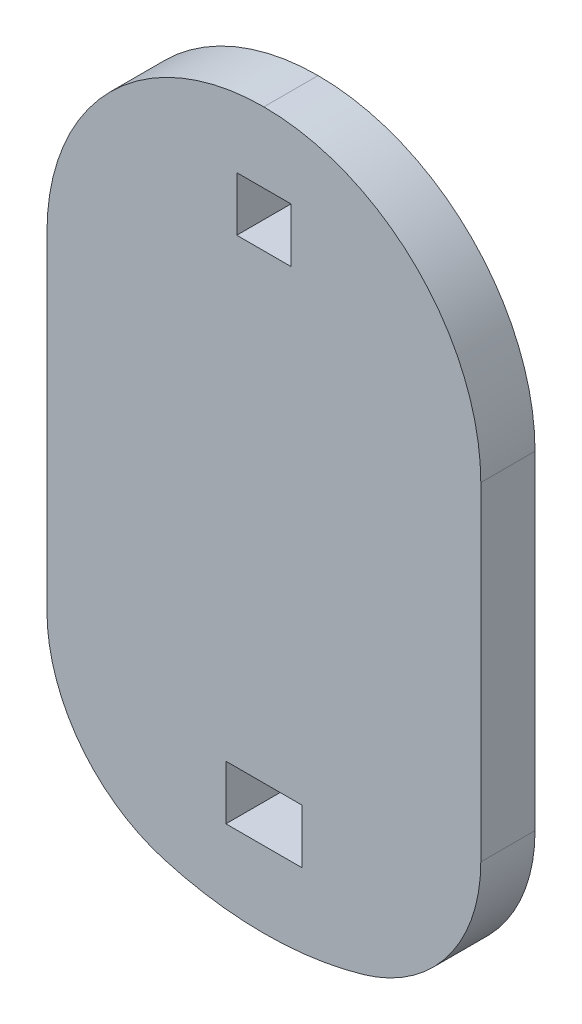
ISO-10303-21;
HEADER;
FILE_DESCRIPTION(('STEP AP214'),'2;1');
FILE_NAME('part.step','',(''),(''),'','','');
FILE_SCHEMA(('AUTOMOTIVE_DESIGN { 1 0 10303 214 1 1 1 1 }'));
ENDSEC;
DATA;
#1=APPLICATION_CONTEXT('core data for automotive mechanical design processes');
#2=APPLICATION_PROTOCOL_DEFINITION('international standard','automotive_design',2000,#1);
#3=PRODUCT_CONTEXT('',#1,'mechanical');
#4=PRODUCT('Part','Part','',(#3));
#5=PRODUCT_RELATED_PRODUCT_CATEGORY('part','',(#4));
#6=PRODUCT_DEFINITION_FORMATION('','',#4);
#7=PRODUCT_DEFINITION_CONTEXT('part definition',#1,'design');
#8=PRODUCT_DEFINITION('design','',#6,#7);
#9=PRODUCT_DEFINITION_SHAPE('','',#8);
#10=(LENGTH_UNIT() NAMED_UNIT(*) SI_UNIT(.MILLI.,.METRE.));
#11=(NAMED_UNIT(*) PLANE_ANGLE_UNIT() SI_UNIT($,.RADIAN.));
#12=(NAMED_UNIT(*) SI_UNIT($,.STERADIAN.) SOLID_ANGLE_UNIT());
#13=UNCERTAINTY_MEASURE_WITH_UNIT(LENGTH_MEASURE(1.E-05),#10,'distance_accuracy_value','');
#14=(GEOMETRIC_REPRESENTATION_CONTEXT(3) GLOBAL_UNCERTAINTY_ASSIGNED_CONTEXT((#13)) GLOBAL_UNIT_ASSIGNED_CONTEXT((#10,
#11,#12)) REPRESENTATION_CONTEXT('',''));
#15=CARTESIAN_POINT('',(0.,0.,0.));
#16=DIRECTION('',(0.,0.,1.));
#17=DIRECTION('',(1.,0.,0.));
#18=AXIS2_PLACEMENT_3D('',#15,#16,#17);
#19=CARTESIAN_POINT('',(0.,0.,5.));
#20=DIRECTION('',(0.,0.,-1.));
#21=DIRECTION('',(-1.,0.,0.));
#22=AXIS2_PLACEMENT_3D('',#19,#20,#21);
#23=CYLINDRICAL_SURFACE('',#22,33.);
#24=CARTESIAN_POINT('',(0.,0.,0.));
#25=DIRECTION('',(0.,0.,1.));
#26=DIRECTION('',(1.,0.,0.));
#27=AXIS2_PLACEMENT_3D('',#24,#25,#26);
#28=CIRCLE('',#27,33.);
#29=CARTESIAN_POINT('',(-9.16666666666666,-31.7012968539494,0.));
#30=VERTEX_POINT('',#29);
#31=CARTESIAN_POINT('',(9.16666666666667,-31.7012968539494,0.));
#32=VERTEX_POINT('',#31);
#33=EDGE_CURVE('E195',#30,#32,#28,.T.);
#34=ORIENTED_EDGE('',*,*,#33,.T.);
#35=DIRECTION('',(0.,0.,-1.));
#36=VECTOR('',#35,1.);
#37=CARTESIAN_POINT('',(9.16666666666667,-31.7012968539494,5.));
#38=LINE('',#37,#36);
#39=CARTESIAN_POINT('',(9.16666666666667,-31.7012968539494,5.));
#40=VERTEX_POINT('',#39);
#41=EDGE_CURVE('E227',#32,#40,#38,.F.);
#42=ORIENTED_EDGE('',*,*,#41,.T.);
#43=CARTESIAN_POINT('',(0.,0.,5.));
#44=DIRECTION('',(0.,0.,1.));
#45=DIRECTION('',(1.,0.,0.));
#46=AXIS2_PLACEMENT_3D('',#43,#44,#45);
#47=CIRCLE('',#46,33.);
#48=CARTESIAN_POINT('',(-9.16666666666666,-31.7012968539494,5.));
#49=VERTEX_POINT('',#48);
#50=EDGE_CURVE('E199',#49,#40,#47,.T.);
#51=ORIENTED_EDGE('',*,*,#50,.F.);
#52=DIRECTION('',(0.,0.,-1.));
#53=VECTOR('',#52,1.);
#54=CARTESIAN_POINT('',(-9.16666666666666,-31.7012968539494,5.));
#55=LINE('',#54,#53);
#56=EDGE_CURVE('E223',#49,#30,#55,.T.);
#57=ORIENTED_EDGE('',*,*,#56,.T.);
#58=EDGE_LOOP('',(#34,#42,#51,#57));
#59=FACE_BOUND('',#58,.T.);
#60=ADVANCED_FACE('F34',(#59),#23,.T.);
#61=CARTESIAN_POINT('',(0.,0.,5.));
#62=DIRECTION('',(0.,0.,1.));
#63=DIRECTION('',(1.,0.,0.));
#64=AXIS2_PLACEMENT_3D('',#61,#62,#63);
#65=PLANE('',#64);
#66=DIRECTION('',(0.,-1.,0.));
#67=VECTOR('',#66,1.);
#68=CARTESIAN_POINT('',(-2.5,26.5,5.));
#69=LINE('',#68,#67);
#70=CARTESIAN_POINT('',(-2.5,26.5,5.));
#71=VERTEX_POINT('',#70);
#72=CARTESIAN_POINT('',(-2.5,21.5,5.));
#73=VERTEX_POINT('',#72);
#74=EDGE_CURVE('E49',#71,#73,#69,.T.);
#75=ORIENTED_EDGE('',*,*,#74,.F.);
#76=DIRECTION('',(-1.,0.,0.));
#77=VECTOR('',#76,1.);
#78=CARTESIAN_POINT('',(-2.5,26.5,5.));
#79=LINE('',#78,#77);
#80=CARTESIAN_POINT('',(2.5,26.5,5.));
#81=VERTEX_POINT('',#80);
#82=EDGE_CURVE('E165',#81,#71,#79,.T.);
#83=ORIENTED_EDGE('',*,*,#82,.F.);
#84=DIRECTION('',(0.,1.,0.));
#85=VECTOR('',#84,1.);
#86=CARTESIAN_POINT('',(2.5,26.5,5.));
#87=LINE('',#86,#85);
#88=CARTESIAN_POINT('',(2.5,21.5,5.));
#89=VERTEX_POINT('',#88);
#90=EDGE_CURVE('E148',#89,#81,#87,.T.);
#91=ORIENTED_EDGE('',*,*,#90,.F.);
#92=DIRECTION('',(1.,0.,0.));
#93=VECTOR('',#92,1.);
#94=CARTESIAN_POINT('',(-2.5,21.5,5.));
#95=LINE('',#94,#93);
#96=EDGE_CURVE('E158',#73,#89,#95,.T.);
#97=ORIENTED_EDGE('',*,*,#96,.F.);
#98=EDGE_LOOP('',(#75,#83,#91,#97));
#99=FACE_BOUND('',#98,.T.);
#100=DIRECTION('',(0.,-1.,0.));
#101=VECTOR('',#100,1.);
#102=CARTESIAN_POINT('',(-3.5,-21.,5.));
#103=LINE('',#102,#101);
#104=CARTESIAN_POINT('',(-3.5,-21.,5.));
#105=VERTEX_POINT('',#104);
#106=CARTESIAN_POINT('',(-3.5,-26.,5.));
#107=VERTEX_POINT('',#106);
#108=EDGE_CURVE('E57',#105,#107,#103,.T.);
#109=ORIENTED_EDGE('',*,*,#108,.F.);
#110=DIRECTION('',(-1.,0.,0.));
#111=VECTOR('',#110,1.);
#112=CARTESIAN_POINT('',(-3.5,-21.,5.));
#113=LINE('',#112,#111);
#114=CARTESIAN_POINT('',(3.5,-21.,5.));
#115=VERTEX_POINT('',#114);
#116=EDGE_CURVE('E182',#115,#105,#113,.T.);
#117=ORIENTED_EDGE('',*,*,#116,.F.);
#118=DIRECTION('',(0.,1.,0.));
#119=VECTOR('',#118,1.);
#120=CARTESIAN_POINT('',(3.5,-21.,5.));
#121=LINE('',#120,#119);
#122=CARTESIAN_POINT('',(3.5,-26.,5.));
#123=VERTEX_POINT('',#122);
#124=EDGE_CURVE('E179',#123,#115,#121,.T.);
#125=ORIENTED_EDGE('',*,*,#124,.F.);
#126=DIRECTION('',(1.,0.,0.));
#127=VECTOR('',#126,1.);
#128=CARTESIAN_POINT('',(-3.5,-26.,5.));
#129=LINE('',#128,#127);
#130=EDGE_CURVE('E176',#107,#123,#129,.T.);
#131=ORIENTED_EDGE('',*,*,#130,.F.);
#132=EDGE_LOOP('',(#109,#117,#125,#131));
#133=FACE_BOUND('',#132,.T.);
#134=ORIENTED_EDGE('',*,*,#50,.T.);
#135=CARTESIAN_POINT('',(5.,-17.2916164657906,5.));
#136=DIRECTION('',(0.,0.,1.));
#137=DIRECTION('',(1.,0.,0.));
#138=AXIS2_PLACEMENT_3D('',#135,#136,#137);
#139=CIRCLE('',#138,15.);
#140=CARTESIAN_POINT('',(20.,-17.2916164657906,5.));
#141=VERTEX_POINT('',#140);
#142=EDGE_CURVE('E232',#40,#141,#139,.T.);
#143=ORIENTED_EDGE('',*,*,#142,.T.);
#144=DIRECTION('',(0.,-1.,0.));
#145=VECTOR('',#144,1.);
#146=CARTESIAN_POINT('',(20.,-26.2488094968134,5.));
#147=LINE('',#146,#145);
#148=CARTESIAN_POINT('',(20.,13.,5.));
#149=VERTEX_POINT('',#148);
#150=EDGE_CURVE('E196',#149,#141,#147,.T.);
#151=ORIENTED_EDGE('',*,*,#150,.F.);
#152=CARTESIAN_POINT('',(0.,13.,5.));
#153=DIRECTION('',(0.,0.,1.));
#154=DIRECTION('',(1.,0.,0.));
#155=AXIS2_PLACEMENT_3D('',#152,#153,#154);
#156=CIRCLE('',#155,20.);
#157=CARTESIAN_POINT('',(0.,33.,5.));
#158=VERTEX_POINT('',#157);
#159=EDGE_CURVE('E209',#149,#158,#156,.T.);
#160=ORIENTED_EDGE('',*,*,#159,.T.);
#161=CARTESIAN_POINT('',(0.,13.,5.));
#162=DIRECTION('',(0.,0.,1.));
#163=DIRECTION('',(1.,0.,0.));
#164=AXIS2_PLACEMENT_3D('',#161,#162,#163);
#165=CIRCLE('',#164,20.);
#166=CARTESIAN_POINT('',(-20.,13.,5.));
#167=VERTEX_POINT('',#166);
#168=EDGE_CURVE('E211',#158,#167,#165,.T.);
#169=ORIENTED_EDGE('',*,*,#168,.T.);
#170=DIRECTION('',(0.,1.,0.));
#171=VECTOR('',#170,1.);
#172=CARTESIAN_POINT('',(-20.,26.2488094968134,5.));
#173=LINE('',#172,#171);
#174=CARTESIAN_POINT('',(-20.,-17.2916164657906,5.));
#175=VERTEX_POINT('',#174);
#176=EDGE_CURVE('E193',#175,#167,#173,.T.);
#177=ORIENTED_EDGE('',*,*,#176,.F.);
#178=CARTESIAN_POINT('',(-5.,-17.2916164657906,5.));
#179=DIRECTION('',(0.,0.,1.));
#180=DIRECTION('',(1.,0.,0.));
#181=AXIS2_PLACEMENT_3D('',#178,#179,#180);
#182=CIRCLE('',#181,15.);
#183=EDGE_CURVE('E230',#175,#49,#182,.T.);
#184=ORIENTED_EDGE('',*,*,#183,.T.);
#185=EDGE_LOOP('',(#134,#143,#151,#160,#169,#177,#184));
#186=FACE_BOUND('',#185,.T.);
#187=ADVANCED_FACE('F162',(#99,#133,#186),#65,.T.);
#188=CARTESIAN_POINT('',(0.,0.,0.));
#189=DIRECTION('',(0.,0.,1.));
#190=DIRECTION('',(1.,0.,0.));
#191=AXIS2_PLACEMENT_3D('',#188,#189,#190);
#192=PLANE('',#191);
#193=DIRECTION('',(-1.,0.,0.));
#194=VECTOR('',#193,1.);
#195=CARTESIAN_POINT('',(0.,26.5,0.));
#196=LINE('',#195,#194);
#197=CARTESIAN_POINT('',(2.5,26.5,0.));
#198=VERTEX_POINT('',#197);
#199=CARTESIAN_POINT('',(-2.5,26.5,0.));
#200=VERTEX_POINT('',#199);
#201=EDGE_CURVE('E42',#198,#200,#196,.T.);
#202=ORIENTED_EDGE('',*,*,#201,.T.);
#203=DIRECTION('',(0.,-1.,0.));
#204=VECTOR('',#203,1.);
#205=CARTESIAN_POINT('',(-2.5,0.,0.));
#206=LINE('',#205,#204);
#207=CARTESIAN_POINT('',(-2.5,21.5,0.));
#208=VERTEX_POINT('',#207);
#209=EDGE_CURVE('E11',#200,#208,#206,.T.);
#210=ORIENTED_EDGE('',*,*,#209,.T.);
#211=DIRECTION('',(1.,0.,0.));
#212=VECTOR('',#211,1.);
#213=CARTESIAN_POINT('',(0.,21.5,0.));
#214=LINE('',#213,#212);
#215=CARTESIAN_POINT('',(2.5,21.5,0.));
#216=VERTEX_POINT('',#215);
#217=EDGE_CURVE('E255',#208,#216,#214,.T.);
#218=ORIENTED_EDGE('',*,*,#217,.T.);
#219=DIRECTION('',(0.,1.,0.));
#220=VECTOR('',#219,1.);
#221=CARTESIAN_POINT('',(2.5,0.,0.));
#222=LINE('',#221,#220);
#223=EDGE_CURVE('E151',#216,#198,#222,.T.);
#224=ORIENTED_EDGE('',*,*,#223,.T.);
#225=EDGE_LOOP('',(#202,#210,#218,#224));
#226=FACE_BOUND('',#225,.T.);
#227=DIRECTION('',(-1.,0.,0.));
#228=VECTOR('',#227,1.);
#229=CARTESIAN_POINT('',(0.,-21.,0.));
#230=LINE('',#229,#228);
#231=CARTESIAN_POINT('',(3.5,-21.,0.));
#232=VERTEX_POINT('',#231);
#233=CARTESIAN_POINT('',(-3.5,-21.,0.));
#234=VERTEX_POINT('',#233);
#235=EDGE_CURVE('E249',#232,#234,#230,.T.);
#236=ORIENTED_EDGE('',*,*,#235,.T.);
#237=DIRECTION('',(0.,-1.,0.));
#238=VECTOR('',#237,1.);
#239=CARTESIAN_POINT('',(-3.5,0.,0.));
#240=LINE('',#239,#238);
#241=CARTESIAN_POINT('',(-3.5,-26.,0.));
#242=VERTEX_POINT('',#241);
#243=EDGE_CURVE('E252',#234,#242,#240,.T.);
#244=ORIENTED_EDGE('',*,*,#243,.T.);
#245=DIRECTION('',(1.,0.,0.));
#246=VECTOR('',#245,1.);
#247=CARTESIAN_POINT('',(0.,-26.,0.));
#248=LINE('',#247,#246);
#249=CARTESIAN_POINT('',(3.5,-26.,0.));
#250=VERTEX_POINT('',#249);
#251=EDGE_CURVE('E243',#242,#250,#248,.T.);
#252=ORIENTED_EDGE('',*,*,#251,.T.);
#253=DIRECTION('',(0.,1.,0.));
#254=VECTOR('',#253,1.);
#255=CARTESIAN_POINT('',(3.5,0.,0.));
#256=LINE('',#255,#254);
#257=EDGE_CURVE('E246',#250,#232,#256,.T.);
#258=ORIENTED_EDGE('',*,*,#257,.T.);
#259=EDGE_LOOP('',(#236,#244,#252,#258));
#260=FACE_BOUND('',#259,.T.);
#261=DIRECTION('',(0.,-1.,0.));
#262=VECTOR('',#261,1.);
#263=CARTESIAN_POINT('',(20.,0.,0.));
#264=LINE('',#263,#262);
#265=CARTESIAN_POINT('',(20.,13.,0.));
#266=VERTEX_POINT('',#265);
#267=CARTESIAN_POINT('',(20.,-17.2916164657906,0.));
#268=VERTEX_POINT('',#267);
#269=EDGE_CURVE('E202',#266,#268,#264,.T.);
#270=ORIENTED_EDGE('',*,*,#269,.T.);
#271=CARTESIAN_POINT('',(5.,-17.2916164657906,0.));
#272=DIRECTION('',(0.,0.,1.));
#273=DIRECTION('',(1.,0.,0.));
#274=AXIS2_PLACEMENT_3D('',#271,#272,#273);
#275=CIRCLE('',#274,15.);
#276=EDGE_CURVE('E238',#268,#32,#275,.F.);
#277=ORIENTED_EDGE('',*,*,#276,.T.);
#278=ORIENTED_EDGE('',*,*,#33,.F.);
#279=CARTESIAN_POINT('',(-5.,-17.2916164657906,0.));
#280=DIRECTION('',(0.,0.,1.));
#281=DIRECTION('',(1.,0.,0.));
#282=AXIS2_PLACEMENT_3D('',#279,#280,#281);
#283=CIRCLE('',#282,15.);
#284=CARTESIAN_POINT('',(-20.,-17.2916164657906,0.));
#285=VERTEX_POINT('',#284);
#286=EDGE_CURVE('E236',#30,#285,#283,.F.);
#287=ORIENTED_EDGE('',*,*,#286,.T.);
#288=DIRECTION('',(0.,1.,0.));
#289=VECTOR('',#288,1.);
#290=CARTESIAN_POINT('',(-20.,0.,0.));
#291=LINE('',#290,#289);
#292=CARTESIAN_POINT('',(-20.,13.,0.));
#293=VERTEX_POINT('',#292);
#294=EDGE_CURVE('E207',#285,#293,#291,.T.);
#295=ORIENTED_EDGE('',*,*,#294,.T.);
#296=CARTESIAN_POINT('',(0.,13.,0.));
#297=DIRECTION('',(0.,0.,1.));
#298=DIRECTION('',(1.,0.,0.));
#299=AXIS2_PLACEMENT_3D('',#296,#297,#298);
#300=CIRCLE('',#299,20.);
#301=CARTESIAN_POINT('',(0.,33.,0.));
#302=VERTEX_POINT('',#301);
#303=EDGE_CURVE('E219',#293,#302,#300,.F.);
#304=ORIENTED_EDGE('',*,*,#303,.T.);
#305=CARTESIAN_POINT('',(0.,13.,0.));
#306=DIRECTION('',(0.,0.,1.));
#307=DIRECTION('',(1.,0.,0.));
#308=AXIS2_PLACEMENT_3D('',#305,#306,#307);
#309=CIRCLE('',#308,20.);
#310=EDGE_CURVE('E217',#302,#266,#309,.F.);
#311=ORIENTED_EDGE('',*,*,#310,.T.);
#312=EDGE_LOOP('',(#270,#277,#278,#287,#295,#304,#311));
#313=FACE_BOUND('',#312,.T.);
#314=ADVANCED_FACE('F259',(#226,#260,#313),#192,.F.);
#315=CARTESIAN_POINT('',(20.,-26.2488094968134,-5.));
#316=DIRECTION('',(-1.,0.,0.));
#317=DIRECTION('',(0.,0.,1.));
#318=AXIS2_PLACEMENT_3D('',#315,#316,#317);
#319=PLANE('',#318);
#320=ORIENTED_EDGE('',*,*,#150,.T.);
#321=DIRECTION('',(0.,0.,-1.));
#322=VECTOR('',#321,1.);
#323=CARTESIAN_POINT('',(20.,-17.2916164657906,-5.));
#324=LINE('',#323,#322);
#325=EDGE_CURVE('E234',#141,#268,#324,.T.);
#326=ORIENTED_EDGE('',*,*,#325,.T.);
#327=ORIENTED_EDGE('',*,*,#269,.F.);
#328=DIRECTION('',(0.,0.,-1.));
#329=VECTOR('',#328,1.);
#330=CARTESIAN_POINT('',(20.,13.,-5.));
#331=LINE('',#330,#329);
#332=EDGE_CURVE('E221',#266,#149,#331,.F.);
#333=ORIENTED_EDGE('',*,*,#332,.T.);
#334=EDGE_LOOP('',(#320,#326,#327,#333));
#335=FACE_BOUND('',#334,.T.);
#336=ADVANCED_FACE('F325',(#335),#319,.F.);
#337=CARTESIAN_POINT('',(-20.,26.2488094968134,-5.));
#338=DIRECTION('',(1.,0.,0.));
#339=DIRECTION('',(0.,0.,-1.));
#340=AXIS2_PLACEMENT_3D('',#337,#338,#339);
#341=PLANE('',#340);
#342=ORIENTED_EDGE('',*,*,#294,.F.);
#343=DIRECTION('',(0.,0.,-1.));
#344=VECTOR('',#343,1.);
#345=CARTESIAN_POINT('',(-20.,-17.2916164657906,-5.));
#346=LINE('',#345,#344);
#347=EDGE_CURVE('E240',#285,#175,#346,.F.);
#348=ORIENTED_EDGE('',*,*,#347,.T.);
#349=ORIENTED_EDGE('',*,*,#176,.T.);
#350=DIRECTION('',(0.,0.,-1.));
#351=VECTOR('',#350,1.);
#352=CARTESIAN_POINT('',(-20.,13.,-5.));
#353=LINE('',#352,#351);
#354=EDGE_CURVE('E214',#167,#293,#353,.T.);
#355=ORIENTED_EDGE('',*,*,#354,.T.);
#356=EDGE_LOOP('',(#342,#348,#349,#355));
#357=FACE_BOUND('',#356,.T.);
#358=ADVANCED_FACE('F294',(#357),#341,.F.);
#359=CARTESIAN_POINT('',(0.,13.,5.));
#360=DIRECTION('',(0.,0.,-1.));
#361=DIRECTION('',(-1.,0.,0.));
#362=AXIS2_PLACEMENT_3D('',#359,#360,#361);
#363=CYLINDRICAL_SURFACE('',#362,20.);
#364=ORIENTED_EDGE('',*,*,#332,.F.);
#365=ORIENTED_EDGE('',*,*,#310,.F.);
#366=DIRECTION('',(0.,0.,-1.));
#367=VECTOR('',#366,1.);
#368=CARTESIAN_POINT('',(0.,33.,5.));
#369=LINE('',#368,#367);
#370=EDGE_CURVE('E172',#158,#302,#369,.T.);
#371=ORIENTED_EDGE('',*,*,#370,.F.);
#372=ORIENTED_EDGE('',*,*,#159,.F.);
#373=EDGE_LOOP('',(#364,#365,#371,#372));
#374=FACE_BOUND('',#373,.T.);
#375=ADVANCED_FACE('F291',(#374),#363,.T.);
#376=CARTESIAN_POINT('',(0.,13.,5.));
#377=DIRECTION('',(0.,0.,-1.));
#378=DIRECTION('',(-1.,0.,0.));
#379=AXIS2_PLACEMENT_3D('',#376,#377,#378);
#380=CYLINDRICAL_SURFACE('',#379,20.);
#381=ORIENTED_EDGE('',*,*,#303,.F.);
#382=ORIENTED_EDGE('',*,*,#354,.F.);
#383=ORIENTED_EDGE('',*,*,#168,.F.);
#384=ORIENTED_EDGE('',*,*,#370,.T.);
#385=EDGE_LOOP('',(#381,#382,#383,#384));
#386=FACE_BOUND('',#385,.T.);
#387=ADVANCED_FACE('F287',(#386),#380,.T.);
#388=CARTESIAN_POINT('',(5.,-17.2916164657906,5.));
#389=DIRECTION('',(0.,0.,-1.));
#390=DIRECTION('',(-1.,0.,0.));
#391=AXIS2_PLACEMENT_3D('',#388,#389,#390);
#392=CYLINDRICAL_SURFACE('',#391,15.);
#393=ORIENTED_EDGE('',*,*,#276,.F.);
#394=ORIENTED_EDGE('',*,*,#325,.F.);
#395=ORIENTED_EDGE('',*,*,#142,.F.);
#396=ORIENTED_EDGE('',*,*,#41,.F.);
#397=EDGE_LOOP('',(#393,#394,#395,#396));
#398=FACE_BOUND('',#397,.T.);
#399=ADVANCED_FACE('F290',(#398),#392,.T.);
#400=CARTESIAN_POINT('',(-5.,-17.2916164657906,5.));
#401=DIRECTION('',(0.,0.,-1.));
#402=DIRECTION('',(-1.,0.,0.));
#403=AXIS2_PLACEMENT_3D('',#400,#401,#402);
#404=CYLINDRICAL_SURFACE('',#403,15.);
#405=ORIENTED_EDGE('',*,*,#286,.F.);
#406=ORIENTED_EDGE('',*,*,#56,.F.);
#407=ORIENTED_EDGE('',*,*,#183,.F.);
#408=ORIENTED_EDGE('',*,*,#347,.F.);
#409=EDGE_LOOP('',(#405,#406,#407,#408));
#410=FACE_BOUND('',#409,.T.);
#411=ADVANCED_FACE('F36',(#410),#404,.T.);
#412=CARTESIAN_POINT('',(-3.5,-21.,-5.));
#413=DIRECTION('',(-1.,0.,0.));
#414=DIRECTION('',(0.,0.,1.));
#415=AXIS2_PLACEMENT_3D('',#412,#413,#414);
#416=PLANE('',#415);
#417=DIRECTION('',(0.,0.,1.));
#418=VECTOR('',#417,1.);
#419=CARTESIAN_POINT('',(-3.5,-21.,-5.));
#420=LINE('',#419,#418);
#421=EDGE_CURVE('E186',#234,#105,#420,.T.);
#422=ORIENTED_EDGE('',*,*,#421,.T.);
#423=ORIENTED_EDGE('',*,*,#108,.T.);
#424=DIRECTION('',(0.,0.,1.));
#425=VECTOR('',#424,1.);
#426=CARTESIAN_POINT('',(-3.5,-26.,-5.));
#427=LINE('',#426,#425);
#428=EDGE_CURVE('E185',#242,#107,#427,.T.);
#429=ORIENTED_EDGE('',*,*,#428,.F.);
#430=ORIENTED_EDGE('',*,*,#243,.F.);
#431=EDGE_LOOP('',(#422,#423,#429,#430));
#432=FACE_BOUND('',#431,.T.);
#433=ADVANCED_FACE('F301',(#432),#416,.F.);
#434=CARTESIAN_POINT('',(-3.5,-21.,-5.));
#435=DIRECTION('',(0.,1.,0.));
#436=DIRECTION('',(0.,0.,1.));
#437=AXIS2_PLACEMENT_3D('',#434,#435,#436);
#438=PLANE('',#437);
#439=DIRECTION('',(0.,0.,1.));
#440=VECTOR('',#439,1.);
#441=CARTESIAN_POINT('',(3.5,-21.,-5.));
#442=LINE('',#441,#440);
#443=EDGE_CURVE('E188',#232,#115,#442,.T.);
#444=ORIENTED_EDGE('',*,*,#443,.T.);
#445=ORIENTED_EDGE('',*,*,#116,.T.);
#446=ORIENTED_EDGE('',*,*,#421,.F.);
#447=ORIENTED_EDGE('',*,*,#235,.F.);
#448=EDGE_LOOP('',(#444,#445,#446,#447));
#449=FACE_BOUND('',#448,.T.);
#450=ADVANCED_FACE('F336',(#449),#438,.F.);
#451=CARTESIAN_POINT('',(3.5,-21.,-5.));
#452=DIRECTION('',(1.,0.,0.));
#453=DIRECTION('',(0.,0.,-1.));
#454=AXIS2_PLACEMENT_3D('',#451,#452,#453);
#455=PLANE('',#454);
#456=DIRECTION('',(0.,0.,1.));
#457=VECTOR('',#456,1.);
#458=CARTESIAN_POINT('',(3.5,-26.,-5.));
#459=LINE('',#458,#457);
#460=EDGE_CURVE('E190',#250,#123,#459,.T.);
#461=ORIENTED_EDGE('',*,*,#460,.T.);
#462=ORIENTED_EDGE('',*,*,#124,.T.);
#463=ORIENTED_EDGE('',*,*,#443,.F.);
#464=ORIENTED_EDGE('',*,*,#257,.F.);
#465=EDGE_LOOP('',(#461,#462,#463,#464));
#466=FACE_BOUND('',#465,.T.);
#467=ADVANCED_FACE('F273',(#466),#455,.F.);
#468=CARTESIAN_POINT('',(-3.5,-26.,-5.));
#469=DIRECTION('',(0.,-1.,0.));
#470=DIRECTION('',(0.,0.,-1.));
#471=AXIS2_PLACEMENT_3D('',#468,#469,#470);
#472=PLANE('',#471);
#473=ORIENTED_EDGE('',*,*,#428,.T.);
#474=ORIENTED_EDGE('',*,*,#130,.T.);
#475=ORIENTED_EDGE('',*,*,#460,.F.);
#476=ORIENTED_EDGE('',*,*,#251,.F.);
#477=EDGE_LOOP('',(#473,#474,#475,#476));
#478=FACE_BOUND('',#477,.T.);
#479=ADVANCED_FACE('F266',(#478),#472,.F.);
#480=CARTESIAN_POINT('',(-2.5,26.5,-5.));
#481=DIRECTION('',(-1.,0.,0.));
#482=DIRECTION('',(0.,0.,1.));
#483=AXIS2_PLACEMENT_3D('',#480,#481,#482);
#484=PLANE('',#483);
#485=DIRECTION('',(0.,0.,1.));
#486=VECTOR('',#485,1.);
#487=CARTESIAN_POINT('',(-2.5,26.5,-5.));
#488=LINE('',#487,#486);
#489=EDGE_CURVE('E170',#200,#71,#488,.T.);
#490=ORIENTED_EDGE('',*,*,#489,.T.);
#491=ORIENTED_EDGE('',*,*,#74,.T.);
#492=DIRECTION('',(0.,0.,1.));
#493=VECTOR('',#492,1.);
#494=CARTESIAN_POINT('',(-2.5,21.5,-5.));
#495=LINE('',#494,#493);
#496=EDGE_CURVE('E155',#208,#73,#495,.T.);
#497=ORIENTED_EDGE('',*,*,#496,.F.);
#498=ORIENTED_EDGE('',*,*,#209,.F.);
#499=EDGE_LOOP('',(#490,#491,#497,#498));
#500=FACE_BOUND('',#499,.T.);
#501=ADVANCED_FACE('F264',(#500),#484,.F.);
#502=CARTESIAN_POINT('',(-2.5,26.5,-5.));
#503=DIRECTION('',(0.,1.,0.));
#504=DIRECTION('',(0.,0.,1.));
#505=AXIS2_PLACEMENT_3D('',#502,#503,#504);
#506=PLANE('',#505);
#507=DIRECTION('',(0.,0.,1.));
#508=VECTOR('',#507,1.);
#509=CARTESIAN_POINT('',(2.5,26.5,-5.));
#510=LINE('',#509,#508);
#511=EDGE_CURVE('E154',#198,#81,#510,.T.);
#512=ORIENTED_EDGE('',*,*,#511,.T.);
#513=ORIENTED_EDGE('',*,*,#82,.T.);
#514=ORIENTED_EDGE('',*,*,#489,.F.);
#515=ORIENTED_EDGE('',*,*,#201,.F.);
#516=EDGE_LOOP('',(#512,#513,#514,#515));
#517=FACE_BOUND('',#516,.T.);
#518=ADVANCED_FACE('F263',(#517),#506,.F.);
#519=CARTESIAN_POINT('',(2.5,26.5,-5.));
#520=DIRECTION('',(1.,0.,0.));
#521=DIRECTION('',(0.,1.,0.));
#522=AXIS2_PLACEMENT_3D('',#519,#520,#521);
#523=PLANE('',#522);
#524=DIRECTION('',(0.,0.,1.));
#525=VECTOR('',#524,1.);
#526=CARTESIAN_POINT('',(2.5,21.5,-5.));
#527=LINE('',#526,#525);
#528=EDGE_CURVE('E143',#216,#89,#527,.T.);
#529=ORIENTED_EDGE('',*,*,#528,.T.);
#530=ORIENTED_EDGE('',*,*,#90,.T.);
#531=ORIENTED_EDGE('',*,*,#511,.F.);
#532=ORIENTED_EDGE('',*,*,#223,.F.);
#533=EDGE_LOOP('',(#529,#530,#531,#532));
#534=FACE_BOUND('',#533,.T.);
#535=ADVANCED_FACE('F145',(#534),#523,.F.);
#536=CARTESIAN_POINT('',(-2.5,21.5,-5.));
#537=DIRECTION('',(0.,-1.,0.));
#538=DIRECTION('',(0.,0.,-1.));
#539=AXIS2_PLACEMENT_3D('',#536,#537,#538);
#540=PLANE('',#539);
#541=ORIENTED_EDGE('',*,*,#496,.T.);
#542=ORIENTED_EDGE('',*,*,#96,.T.);
#543=ORIENTED_EDGE('',*,*,#528,.F.);
#544=ORIENTED_EDGE('',*,*,#217,.F.);
#545=EDGE_LOOP('',(#541,#542,#543,#544));
#546=FACE_BOUND('',#545,.T.);
#547=ADVANCED_FACE('F159',(#546),#540,.F.);
#548=CLOSED_SHELL('',(#60,#187,#314,#336,#358,#375,#387,#399,#411,#433,#450,#467,#479,#501,#518,
#535,#547));
#549=MANIFOLD_SOLID_BREP('B2',#548);
#550=ADVANCED_BREP_SHAPE_REPRESENTATION('',(#18,#549),#14);
#551=SHAPE_DEFINITION_REPRESENTATION(#9,#550);
ENDSEC;
END-ISO-10303-21;
